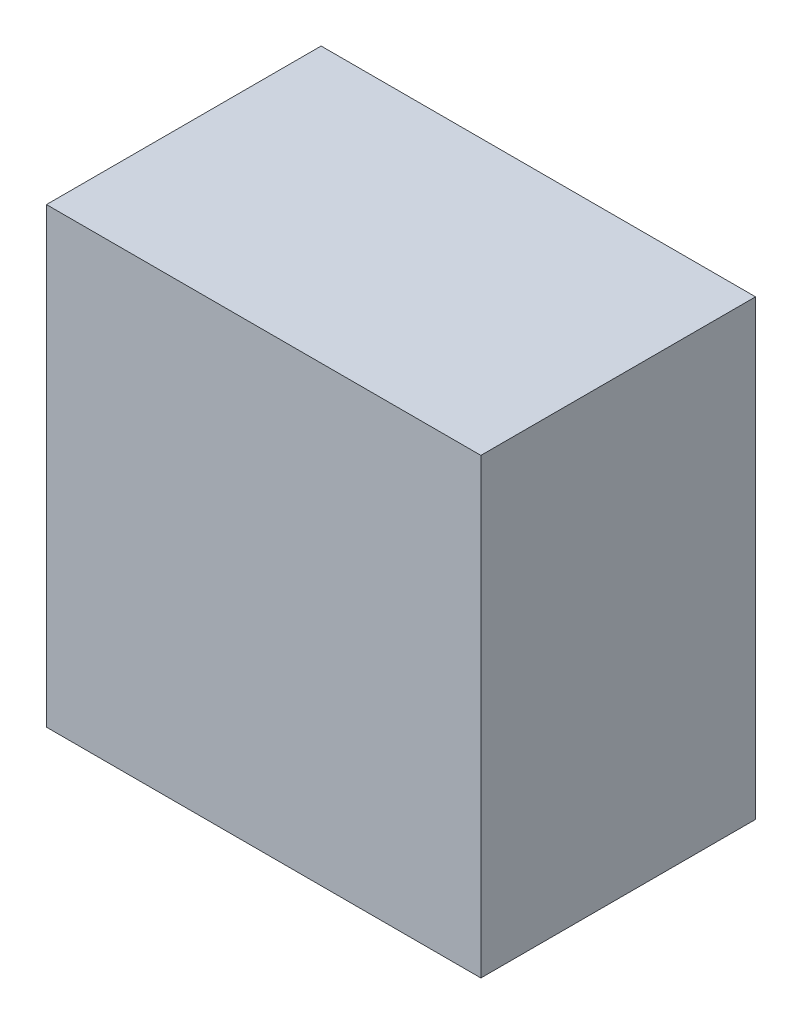
ISO-10303-21;
HEADER;
FILE_DESCRIPTION(('STEP AP214'),'2;1');
FILE_NAME('part.step','',(''),(''),'','','');
FILE_SCHEMA(('AUTOMOTIVE_DESIGN { 1 0 10303 214 1 1 1 1 }'));
ENDSEC;
DATA;
#1=APPLICATION_CONTEXT('core data for automotive mechanical design processes');
#2=APPLICATION_PROTOCOL_DEFINITION('international standard','automotive_design',2000,#1);
#3=PRODUCT_CONTEXT('',#1,'mechanical');
#4=PRODUCT('Part','Part','',(#3));
#5=PRODUCT_RELATED_PRODUCT_CATEGORY('part','',(#4));
#6=PRODUCT_DEFINITION_FORMATION('','',#4);
#7=PRODUCT_DEFINITION_CONTEXT('part definition',#1,'design');
#8=PRODUCT_DEFINITION('design','',#6,#7);
#9=PRODUCT_DEFINITION_SHAPE('','',#8);
#10=(LENGTH_UNIT() NAMED_UNIT(*) SI_UNIT(.MILLI.,.METRE.));
#11=(NAMED_UNIT(*) PLANE_ANGLE_UNIT() SI_UNIT($,.RADIAN.));
#12=(NAMED_UNIT(*) SI_UNIT($,.STERADIAN.) SOLID_ANGLE_UNIT());
#13=UNCERTAINTY_MEASURE_WITH_UNIT(LENGTH_MEASURE(1.E-05),#10,'distance_accuracy_value','');
#14=(GEOMETRIC_REPRESENTATION_CONTEXT(3) GLOBAL_UNCERTAINTY_ASSIGNED_CONTEXT((#13)) GLOBAL_UNIT_ASSIGNED_CONTEXT((#10,
#11,#12)) REPRESENTATION_CONTEXT('',''));
#15=CARTESIAN_POINT('',(0.,0.,0.));
#16=DIRECTION('',(0.,0.,1.));
#17=DIRECTION('',(1.,0.,0.));
#18=AXIS2_PLACEMENT_3D('',#15,#16,#17);
#19=CARTESIAN_POINT('',(0.,-0.4635,0.8));
#20=DIRECTION('',(0.,0.,1.));
#21=DIRECTION('',(1.,0.,0.));
#22=AXIS2_PLACEMENT_3D('',#19,#20,#21);
#23=PLANE('',#22);
#24=DIRECTION('',(1.,0.,0.));
#25=VECTOR('',#24,1.);
#26=CARTESIAN_POINT('',(-0.6327,-1.1227,0.8));
#27=LINE('',#26,#25);
#28=CARTESIAN_POINT('',(-0.6327,-1.1227,0.8));
#29=VERTEX_POINT('',#28);
#30=CARTESIAN_POINT('',(0.6327,-1.1227,0.8));
#31=VERTEX_POINT('',#30);
#32=EDGE_CURVE('E90',#29,#31,#27,.T.);
#33=ORIENTED_EDGE('',*,*,#32,.T.);
#34=DIRECTION('',(0.,1.,0.));
#35=VECTOR('',#34,1.);
#36=CARTESIAN_POINT('',(0.6327,-1.1227,0.8));
#37=LINE('',#36,#35);
#38=CARTESIAN_POINT('',(0.6327,0.1957,0.8));
#39=VERTEX_POINT('',#38);
#40=EDGE_CURVE('E63',#31,#39,#37,.T.);
#41=ORIENTED_EDGE('',*,*,#40,.T.);
#42=DIRECTION('',(-1.,0.,0.));
#43=VECTOR('',#42,1.);
#44=CARTESIAN_POINT('',(0.6327,0.1957,0.8));
#45=LINE('',#44,#43);
#46=CARTESIAN_POINT('',(-0.6327,0.1957,0.8));
#47=VERTEX_POINT('',#46);
#48=EDGE_CURVE('E83',#39,#47,#45,.T.);
#49=ORIENTED_EDGE('',*,*,#48,.T.);
#50=DIRECTION('',(0.,-1.,0.));
#51=VECTOR('',#50,1.);
#52=CARTESIAN_POINT('',(-0.6327,0.1957,0.8));
#53=LINE('',#52,#51);
#54=EDGE_CURVE('E11',#47,#29,#53,.T.);
#55=ORIENTED_EDGE('',*,*,#54,.T.);
#56=EDGE_LOOP('',(#33,#41,#49,#55));
#57=FACE_BOUND('',#56,.T.);
#58=ADVANCED_FACE('F16',(#57),#23,.T.);
#59=CARTESIAN_POINT('',(0.,-0.4635,0.));
#60=DIRECTION('',(0.,0.,1.));
#61=DIRECTION('',(1.,0.,0.));
#62=AXIS2_PLACEMENT_3D('',#59,#60,#61);
#63=PLANE('',#62);
#64=DIRECTION('',(1.,0.,0.));
#65=VECTOR('',#64,1.);
#66=CARTESIAN_POINT('',(-0.6327,-1.1227,0.));
#67=LINE('',#66,#65);
#68=CARTESIAN_POINT('',(-0.6327,-1.1227,0.));
#69=VERTEX_POINT('',#68);
#70=CARTESIAN_POINT('',(0.6327,-1.1227,0.));
#71=VERTEX_POINT('',#70);
#72=EDGE_CURVE('E100',#69,#71,#67,.T.);
#73=ORIENTED_EDGE('',*,*,#72,.F.);
#74=DIRECTION('',(0.,-1.,0.));
#75=VECTOR('',#74,1.);
#76=CARTESIAN_POINT('',(-0.6327,0.1957,0.));
#77=LINE('',#76,#75);
#78=CARTESIAN_POINT('',(-0.6327,0.1957,0.));
#79=VERTEX_POINT('',#78);
#80=EDGE_CURVE('E26',#79,#69,#77,.T.);
#81=ORIENTED_EDGE('',*,*,#80,.F.);
#82=DIRECTION('',(-1.,0.,0.));
#83=VECTOR('',#82,1.);
#84=CARTESIAN_POINT('',(0.6327,0.1957,0.));
#85=LINE('',#84,#83);
#86=CARTESIAN_POINT('',(0.6327,0.1957,0.));
#87=VERTEX_POINT('',#86);
#88=EDGE_CURVE('E70',#87,#79,#85,.T.);
#89=ORIENTED_EDGE('',*,*,#88,.F.);
#90=DIRECTION('',(0.,1.,0.));
#91=VECTOR('',#90,1.);
#92=CARTESIAN_POINT('',(0.6327,-1.1227,0.));
#93=LINE('',#92,#91);
#94=EDGE_CURVE('E74',#71,#87,#93,.T.);
#95=ORIENTED_EDGE('',*,*,#94,.F.);
#96=EDGE_LOOP('',(#73,#81,#89,#95));
#97=FACE_BOUND('',#96,.T.);
#98=ADVANCED_FACE('F18',(#97),#63,.F.);
#99=CARTESIAN_POINT('',(-0.6327,0.1957,0.));
#100=DIRECTION('',(1.,0.,0.));
#101=DIRECTION('',(0.,1.,0.));
#102=AXIS2_PLACEMENT_3D('',#99,#100,#101);
#103=PLANE('',#102);
#104=DIRECTION('',(0.,0.,1.));
#105=VECTOR('',#104,1.);
#106=CARTESIAN_POINT('',(-0.6327,0.1957,0.));
#107=LINE('',#106,#105);
#108=EDGE_CURVE('E79',#79,#47,#107,.T.);
#109=ORIENTED_EDGE('',*,*,#108,.F.);
#110=ORIENTED_EDGE('',*,*,#80,.T.);
#111=DIRECTION('',(0.,0.,1.));
#112=VECTOR('',#111,1.);
#113=CARTESIAN_POINT('',(-0.6327,-1.1227,0.));
#114=LINE('',#113,#112);
#115=EDGE_CURVE('E106',#69,#29,#114,.T.);
#116=ORIENTED_EDGE('',*,*,#115,.T.);
#117=ORIENTED_EDGE('',*,*,#54,.F.);
#118=EDGE_LOOP('',(#109,#110,#116,#117));
#119=FACE_BOUND('',#118,.T.);
#120=ADVANCED_FACE('F112',(#119),#103,.F.);
#121=CARTESIAN_POINT('',(0.6327,0.1957,0.));
#122=DIRECTION('',(0.,-1.,0.));
#123=DIRECTION('',(0.,0.,-1.));
#124=AXIS2_PLACEMENT_3D('',#121,#122,#123);
#125=PLANE('',#124);
#126=DIRECTION('',(0.,0.,1.));
#127=VECTOR('',#126,1.);
#128=CARTESIAN_POINT('',(0.6327,0.1957,0.));
#129=LINE('',#128,#127);
#130=EDGE_CURVE('E81',#87,#39,#129,.T.);
#131=ORIENTED_EDGE('',*,*,#130,.F.);
#132=ORIENTED_EDGE('',*,*,#88,.T.);
#133=ORIENTED_EDGE('',*,*,#108,.T.);
#134=ORIENTED_EDGE('',*,*,#48,.F.);
#135=EDGE_LOOP('',(#131,#132,#133,#134));
#136=FACE_BOUND('',#135,.T.);
#137=ADVANCED_FACE('F82',(#136),#125,.F.);
#138=CARTESIAN_POINT('',(0.6327,-1.1227,0.));
#139=DIRECTION('',(-1.,0.,0.));
#140=DIRECTION('',(0.,0.,1.));
#141=AXIS2_PLACEMENT_3D('',#138,#139,#140);
#142=PLANE('',#141);
#143=DIRECTION('',(0.,0.,1.));
#144=VECTOR('',#143,1.);
#145=CARTESIAN_POINT('',(0.6327,-1.1227,0.));
#146=LINE('',#145,#144);
#147=EDGE_CURVE('E87',#71,#31,#146,.T.);
#148=ORIENTED_EDGE('',*,*,#147,.F.);
#149=ORIENTED_EDGE('',*,*,#94,.T.);
#150=ORIENTED_EDGE('',*,*,#130,.T.);
#151=ORIENTED_EDGE('',*,*,#40,.F.);
#152=EDGE_LOOP('',(#148,#149,#150,#151));
#153=FACE_BOUND('',#152,.T.);
#154=ADVANCED_FACE('F85',(#153),#142,.F.);
#155=CARTESIAN_POINT('',(-0.6327,-1.1227,0.));
#156=DIRECTION('',(0.,1.,0.));
#157=DIRECTION('',(1.,0.,0.));
#158=AXIS2_PLACEMENT_3D('',#155,#156,#157);
#159=PLANE('',#158);
#160=ORIENTED_EDGE('',*,*,#115,.F.);
#161=ORIENTED_EDGE('',*,*,#72,.T.);
#162=ORIENTED_EDGE('',*,*,#147,.T.);
#163=ORIENTED_EDGE('',*,*,#32,.F.);
#164=EDGE_LOOP('',(#160,#161,#162,#163));
#165=FACE_BOUND('',#164,.T.);
#166=ADVANCED_FACE('F115',(#165),#159,.F.);
#167=CLOSED_SHELL('',(#58,#98,#120,#137,#154,#166));
#168=MANIFOLD_SOLID_BREP('B1',#167);
#169=ADVANCED_BREP_SHAPE_REPRESENTATION('',(#18,#168),#14);
#170=SHAPE_DEFINITION_REPRESENTATION(#9,#169);
ENDSEC;
END-ISO-10303-21;
